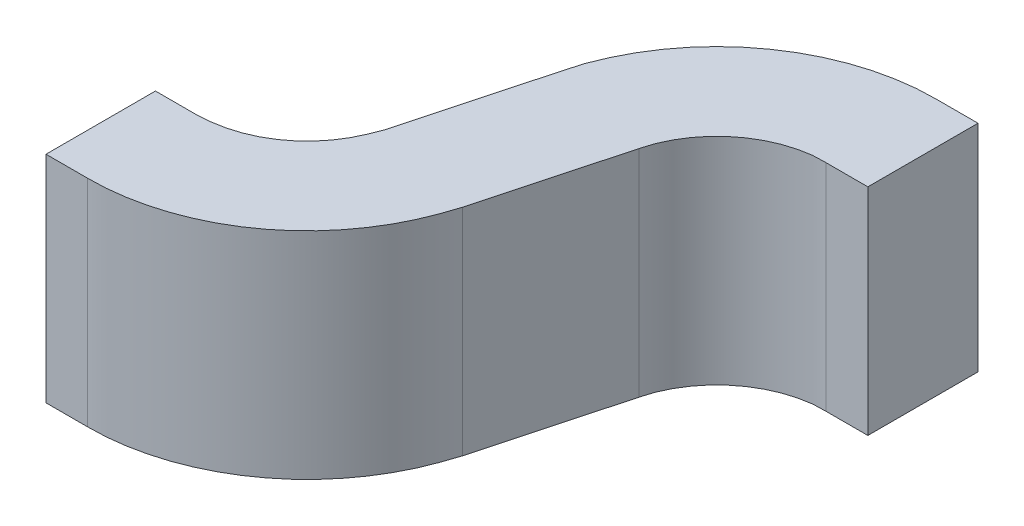
ISO-10303-21;
HEADER;
FILE_DESCRIPTION(('STEP AP214'),'2;1');
FILE_NAME('part.step','',(''),(''),'','','');
FILE_SCHEMA(('AUTOMOTIVE_DESIGN { 1 0 10303 214 1 1 1 1 }'));
ENDSEC;
DATA;
#1=APPLICATION_CONTEXT('core data for automotive mechanical design processes');
#2=APPLICATION_PROTOCOL_DEFINITION('international standard','automotive_design',2000,#1);
#3=PRODUCT_CONTEXT('',#1,'mechanical');
#4=PRODUCT('Part','Part','',(#3));
#5=PRODUCT_RELATED_PRODUCT_CATEGORY('part','',(#4));
#6=PRODUCT_DEFINITION_FORMATION('','',#4);
#7=PRODUCT_DEFINITION_CONTEXT('part definition',#1,'design');
#8=PRODUCT_DEFINITION('design','',#6,#7);
#9=PRODUCT_DEFINITION_SHAPE('','',#8);
#10=(LENGTH_UNIT() NAMED_UNIT(*) SI_UNIT(.MILLI.,.METRE.));
#11=(NAMED_UNIT(*) PLANE_ANGLE_UNIT() SI_UNIT($,.RADIAN.));
#12=(NAMED_UNIT(*) SI_UNIT($,.STERADIAN.) SOLID_ANGLE_UNIT());
#13=UNCERTAINTY_MEASURE_WITH_UNIT(LENGTH_MEASURE(1.E-05),#10,'distance_accuracy_value','');
#14=(GEOMETRIC_REPRESENTATION_CONTEXT(3) GLOBAL_UNCERTAINTY_ASSIGNED_CONTEXT((#13)) GLOBAL_UNIT_ASSIGNED_CONTEXT((#10,
#11,#12)) REPRESENTATION_CONTEXT('',''));
#15=CARTESIAN_POINT('',(0.,0.,0.));
#16=DIRECTION('',(0.,0.,1.));
#17=DIRECTION('',(1.,0.,0.));
#18=AXIS2_PLACEMENT_3D('',#15,#16,#17);
#19=CARTESIAN_POINT('',(1.054,-0.348,0.543));
#20=DIRECTION('',(-1.,0.,0.));
#21=DIRECTION('',(0.,0.,1.));
#22=AXIS2_PLACEMENT_3D('',#19,#20,#21);
#23=PLANE('',#22);
#24=DIRECTION('',(0.,1.,0.));
#25=VECTOR('',#24,1.);
#26=CARTESIAN_POINT('',(1.054,-0.653,0.543));
#27=LINE('',#26,#25);
#28=CARTESIAN_POINT('',(1.054,-0.653,0.543));
#29=VERTEX_POINT('',#28);
#30=CARTESIAN_POINT('',(1.054,-0.348,0.543));
#31=VERTEX_POINT('',#30);
#32=EDGE_CURVE('E11',#29,#31,#27,.T.);
#33=ORIENTED_EDGE('',*,*,#32,.F.);
#34=DIRECTION('',(0.,0.,-1.));
#35=VECTOR('',#34,1.);
#36=CARTESIAN_POINT('',(1.054,-0.653,0.698));
#37=LINE('',#36,#35);
#38=CARTESIAN_POINT('',(1.054,-0.653,0.698));
#39=VERTEX_POINT('',#38);
#40=EDGE_CURVE('E24',#39,#29,#37,.T.);
#41=ORIENTED_EDGE('',*,*,#40,.F.);
#42=DIRECTION('',(0.,-1.,0.));
#43=VECTOR('',#42,1.);
#44=CARTESIAN_POINT('',(1.054,-0.348,0.698));
#45=LINE('',#44,#43);
#46=CARTESIAN_POINT('',(1.054,-0.348,0.698));
#47=VERTEX_POINT('',#46);
#48=EDGE_CURVE('E439',#47,#39,#45,.T.);
#49=ORIENTED_EDGE('',*,*,#48,.F.);
#50=DIRECTION('',(0.,0.,1.));
#51=VECTOR('',#50,1.);
#52=CARTESIAN_POINT('',(1.054,-0.348,0.543));
#53=LINE('',#52,#51);
#54=EDGE_CURVE('E437',#31,#47,#53,.T.);
#55=ORIENTED_EDGE('',*,*,#54,.F.);
#56=EDGE_LOOP('',(#33,#41,#49,#55));
#57=FACE_BOUND('',#56,.T.);
#58=ADVANCED_FACE('F17',(#57),#23,.T.);
#59=CARTESIAN_POINT('',(1.054,-0.348,0.698));
#60=DIRECTION('',(0.,0.,1.));
#61=DIRECTION('',(0.,1.,0.));
#62=AXIS2_PLACEMENT_3D('',#59,#60,#61);
#63=PLANE('',#62);
#64=ORIENTED_EDGE('',*,*,#48,.T.);
#65=DIRECTION('',(-1.,0.,0.));
#66=VECTOR('',#65,1.);
#67=CARTESIAN_POINT('',(1.113,-0.653,0.698));
#68=LINE('',#67,#66);
#69=CARTESIAN_POINT('',(1.113,-0.653,0.698));
#70=VERTEX_POINT('',#69);
#71=EDGE_CURVE('E435',#70,#39,#68,.T.);
#72=ORIENTED_EDGE('',*,*,#71,.F.);
#73=CARTESIAN_POINT('',(1.113,-0.348,0.69815));
#74=DIRECTION('',(0.,-1.,0.));
#75=VECTOR('',#74,1.);
#76=LINE('',#73,#75);
#77=CARTESIAN_POINT('',(1.113,-0.348,0.698));
#78=VERTEX_POINT('',#77);
#79=EDGE_CURVE('E257',#78,#70,#76,.T.);
#80=ORIENTED_EDGE('',*,*,#79,.F.);
#81=DIRECTION('',(1.,0.,0.));
#82=VECTOR('',#81,1.);
#83=CARTESIAN_POINT('',(1.054,-0.348,0.698));
#84=LINE('',#83,#82);
#85=EDGE_CURVE('E247',#47,#78,#84,.T.);
#86=ORIENTED_EDGE('',*,*,#85,.F.);
#87=EDGE_LOOP('',(#64,#72,#80,#86));
#88=FACE_BOUND('',#87,.T.);
#89=ADVANCED_FACE('F237',(#88),#63,.T.);
#90=CARTESIAN_POINT('',(1.054,-0.653,0.543));
#91=DIRECTION('',(0.,0.,-1.));
#92=DIRECTION('',(0.,1.,0.));
#93=AXIS2_PLACEMENT_3D('',#90,#91,#92);
#94=PLANE('',#93);
#95=ORIENTED_EDGE('',*,*,#32,.T.);
#96=DIRECTION('',(-1.,0.,0.));
#97=VECTOR('',#96,1.);
#98=CARTESIAN_POINT('',(1.113,-0.348,0.543));
#99=LINE('',#98,#97);
#100=CARTESIAN_POINT('',(1.113,-0.348,0.543));
#101=VERTEX_POINT('',#100);
#102=EDGE_CURVE('E443',#101,#31,#99,.T.);
#103=ORIENTED_EDGE('',*,*,#102,.F.);
#104=CARTESIAN_POINT('',(1.113,-0.653,0.542575));
#105=DIRECTION('',(0.,1.,0.));
#106=VECTOR('',#105,1.);
#107=LINE('',#104,#106);
#108=CARTESIAN_POINT('',(1.113,-0.653,0.543));
#109=VERTEX_POINT('',#108);
#110=EDGE_CURVE('E222',#109,#101,#107,.T.);
#111=ORIENTED_EDGE('',*,*,#110,.F.);
#112=DIRECTION('',(1.,0.,0.));
#113=VECTOR('',#112,1.);
#114=CARTESIAN_POINT('',(1.054,-0.653,0.543));
#115=LINE('',#114,#113);
#116=EDGE_CURVE('E219',#29,#109,#115,.T.);
#117=ORIENTED_EDGE('',*,*,#116,.F.);
#118=EDGE_LOOP('',(#95,#103,#111,#117));
#119=FACE_BOUND('',#118,.T.);
#120=ADVANCED_FACE('F228',(#119),#94,.T.);
#121=CARTESIAN_POINT('',(1.467,-0.653,0.271));
#122=DIRECTION('',(0.965885549343203,0.,0.258969313954337));
#123=DIRECTION('',(-0.258969313954337,0.,0.965885549343203));
#124=AXIS2_PLACEMENT_3D('',#121,#122,#123);
#125=PLANE('',#124);
#126=CARTESIAN_POINT('',(1.46667799927154,-0.348,0.270914133139076));
#127=DIRECTION('',(0.,-1.,0.));
#128=VECTOR('',#127,1.);
#129=LINE('',#126,#128);
#130=CARTESIAN_POINT('',(1.467,-0.348,0.271));
#131=VERTEX_POINT('',#130);
#132=CARTESIAN_POINT('',(1.467,-0.653,0.271));
#133=VERTEX_POINT('',#132);
#134=EDGE_CURVE('E215',#131,#133,#129,.T.);
#135=ORIENTED_EDGE('',*,*,#134,.F.);
#136=CARTESIAN_POINT('',(1.414,-0.348,0.468));
#137=DIRECTION('',(0.258969313954337,0.,-0.965885549343202));
#138=VECTOR('',#137,1.);
#139=LINE('',#136,#138);
#140=CARTESIAN_POINT('',(1.414,-0.348,0.468));
#141=VERTEX_POINT('',#140);
#142=EDGE_CURVE('E301',#141,#131,#139,.T.);
#143=ORIENTED_EDGE('',*,*,#142,.F.);
#144=CARTESIAN_POINT('',(1.41346097901335,-0.653,0.467854947840802));
#145=DIRECTION('',(0.,1.,0.));
#146=VECTOR('',#145,1.);
#147=LINE('',#144,#146);
#148=CARTESIAN_POINT('',(1.414,-0.653,0.468));
#149=VERTEX_POINT('',#148);
#150=EDGE_CURVE('E288',#149,#141,#147,.T.);
#151=ORIENTED_EDGE('',*,*,#150,.F.);
#152=DIRECTION('',(-0.258969313954337,0.,0.965885549343203));
#153=VECTOR('',#152,1.);
#154=CARTESIAN_POINT('',(1.467,-0.653,0.271));
#155=LINE('',#154,#153);
#156=EDGE_CURVE('E356',#133,#149,#155,.T.);
#157=ORIENTED_EDGE('',*,*,#156,.F.);
#158=EDGE_LOOP('',(#135,#143,#151,#157));
#159=FACE_BOUND('',#158,.T.);
#160=ADVANCED_FACE('F236',(#159),#125,.T.);
#161=CARTESIAN_POINT('',(1.317,-0.348,0.231));
#162=DIRECTION('',(-0.965885549343203,0.,-0.258969313954337));
#163=DIRECTION('',(-0.258969313954337,0.,0.965885549343203));
#164=AXIS2_PLACEMENT_3D('',#161,#162,#163);
#165=PLANE('',#164);
#166=CARTESIAN_POINT('',(1.31635599854307,-0.653,0.230828266278153));
#167=DIRECTION('',(0.,1.,0.));
#168=VECTOR('',#167,1.);
#169=LINE('',#166,#168);
#170=CARTESIAN_POINT('',(1.317,-0.653,0.231));
#171=VERTEX_POINT('',#170);
#172=CARTESIAN_POINT('',(1.317,-0.348,0.231));
#173=VERTEX_POINT('',#172);
#174=EDGE_CURVE('E342',#171,#173,#169,.T.);
#175=ORIENTED_EDGE('',*,*,#174,.F.);
#176=CARTESIAN_POINT('',(1.264,-0.653,0.428));
#177=DIRECTION('',(0.258969313954337,0.,-0.965885549343202));
#178=VECTOR('',#177,1.);
#179=LINE('',#176,#178);
#180=CARTESIAN_POINT('',(1.264,-0.653,0.428));
#181=VERTEX_POINT('',#180);
#182=EDGE_CURVE('E330',#181,#171,#179,.T.);
#183=ORIENTED_EDGE('',*,*,#182,.F.);
#184=CARTESIAN_POINT('',(1.2631389278252,-0.348,0.427766198945916));
#185=DIRECTION('',(0.,-1.,0.));
#186=VECTOR('',#185,1.);
#187=LINE('',#184,#186);
#188=CARTESIAN_POINT('',(1.264,-0.348,0.428));
#189=VERTEX_POINT('',#188);
#190=EDGE_CURVE('E366',#189,#181,#187,.T.);
#191=ORIENTED_EDGE('',*,*,#190,.F.);
#192=DIRECTION('',(-0.258969313954337,0.,0.965885549343203));
#193=VECTOR('',#192,1.);
#194=CARTESIAN_POINT('',(1.317,-0.348,0.231));
#195=LINE('',#194,#193);
#196=EDGE_CURVE('E368',#173,#189,#195,.T.);
#197=ORIENTED_EDGE('',*,*,#196,.F.);
#198=EDGE_LOOP('',(#175,#183,#191,#197));
#199=FACE_BOUND('',#198,.T.);
#200=ADVANCED_FACE('F160',(#199),#165,.T.);
#201=CARTESIAN_POINT('',(1.676,-0.653,0.156));
#202=DIRECTION('',(0.,0.,1.));
#203=DIRECTION('',(0.,1.,0.));
#204=AXIS2_PLACEMENT_3D('',#201,#202,#203);
#205=PLANE('',#204);
#206=DIRECTION('',(0.,-1.,0.));
#207=VECTOR('',#206,1.);
#208=CARTESIAN_POINT('',(1.676,-0.348,0.156));
#209=LINE('',#208,#207);
#210=CARTESIAN_POINT('',(1.676,-0.348,0.156));
#211=VERTEX_POINT('',#210);
#212=CARTESIAN_POINT('',(1.676,-0.653,0.156));
#213=VERTEX_POINT('',#212);
#214=EDGE_CURVE('E125',#211,#213,#209,.T.);
#215=ORIENTED_EDGE('',*,*,#214,.F.);
#216=DIRECTION('',(1.,0.,0.));
#217=VECTOR('',#216,1.);
#218=CARTESIAN_POINT('',(1.617,-0.348,0.156));
#219=LINE('',#218,#217);
#220=CARTESIAN_POINT('',(1.617,-0.348,0.156));
#221=VERTEX_POINT('',#220);
#222=EDGE_CURVE('E377',#221,#211,#219,.T.);
#223=ORIENTED_EDGE('',*,*,#222,.F.);
#224=CARTESIAN_POINT('',(1.617,-0.653,0.155425));
#225=DIRECTION('',(0.,1.,0.));
#226=VECTOR('',#225,1.);
#227=LINE('',#224,#226);
#228=CARTESIAN_POINT('',(1.617,-0.653,0.156));
#229=VERTEX_POINT('',#228);
#230=EDGE_CURVE('E178',#229,#221,#227,.T.);
#231=ORIENTED_EDGE('',*,*,#230,.F.);
#232=DIRECTION('',(-1.,0.,0.));
#233=VECTOR('',#232,1.);
#234=CARTESIAN_POINT('',(1.676,-0.653,0.156));
#235=LINE('',#234,#233);
#236=EDGE_CURVE('E169',#213,#229,#235,.T.);
#237=ORIENTED_EDGE('',*,*,#236,.F.);
#238=EDGE_LOOP('',(#215,#223,#231,#237));
#239=FACE_BOUND('',#238,.T.);
#240=ADVANCED_FACE('F155',(#239),#205,.T.);
#241=CARTESIAN_POINT('',(1.617,-0.653,0.));
#242=DIRECTION('',(0.,0.,-1.));
#243=DIRECTION('',(0.,1.,0.));
#244=AXIS2_PLACEMENT_3D('',#241,#242,#243);
#245=PLANE('',#244);
#246=CARTESIAN_POINT('',(1.617,-0.348,-0.000149999999999977));
#247=DIRECTION('',(0.,-1.,0.));
#248=VECTOR('',#247,1.);
#249=LINE('',#246,#248);
#250=CARTESIAN_POINT('',(1.617,-0.348,0.));
#251=VERTEX_POINT('',#250);
#252=CARTESIAN_POINT('',(1.617,-0.653,0.));
#253=VERTEX_POINT('',#252);
#254=EDGE_CURVE('E140',#251,#253,#249,.T.);
#255=ORIENTED_EDGE('',*,*,#254,.F.);
#256=DIRECTION('',(-1.,0.,0.));
#257=VECTOR('',#256,1.);
#258=CARTESIAN_POINT('',(1.676,-0.348,0.));
#259=LINE('',#258,#257);
#260=CARTESIAN_POINT('',(1.676,-0.348,0.));
#261=VERTEX_POINT('',#260);
#262=EDGE_CURVE('E107',#261,#251,#259,.T.);
#263=ORIENTED_EDGE('',*,*,#262,.F.);
#264=DIRECTION('',(0.,1.,0.));
#265=VECTOR('',#264,1.);
#266=CARTESIAN_POINT('',(1.676,-0.653,0.));
#267=LINE('',#266,#265);
#268=CARTESIAN_POINT('',(1.676,-0.653,0.));
#269=VERTEX_POINT('',#268);
#270=EDGE_CURVE('E101',#269,#261,#267,.T.);
#271=ORIENTED_EDGE('',*,*,#270,.F.);
#272=DIRECTION('',(1.,0.,0.));
#273=VECTOR('',#272,1.);
#274=CARTESIAN_POINT('',(1.617,-0.653,0.));
#275=LINE('',#274,#273);
#276=EDGE_CURVE('E104',#253,#269,#275,.T.);
#277=ORIENTED_EDGE('',*,*,#276,.F.);
#278=EDGE_LOOP('',(#255,#263,#271,#277));
#279=FACE_BOUND('',#278,.T.);
#280=ADVANCED_FACE('F103',(#279),#245,.T.);
#281=CARTESIAN_POINT('',(1.676,-0.653,0.));
#282=DIRECTION('',(1.,0.,0.));
#283=DIRECTION('',(0.,0.,1.));
#284=AXIS2_PLACEMENT_3D('',#281,#282,#283);
#285=PLANE('',#284);
#286=ORIENTED_EDGE('',*,*,#270,.T.);
#287=DIRECTION('',(0.,0.,-1.));
#288=VECTOR('',#287,1.);
#289=CARTESIAN_POINT('',(1.676,-0.348,0.156));
#290=LINE('',#289,#288);
#291=EDGE_CURVE('E122',#211,#261,#290,.T.);
#292=ORIENTED_EDGE('',*,*,#291,.F.);
#293=ORIENTED_EDGE('',*,*,#214,.T.);
#294=DIRECTION('',(0.,0.,1.));
#295=VECTOR('',#294,1.);
#296=CARTESIAN_POINT('',(1.676,-0.653,0.));
#297=LINE('',#296,#295);
#298=EDGE_CURVE('E118',#269,#213,#297,.T.);
#299=ORIENTED_EDGE('',*,*,#298,.F.);
#300=EDGE_LOOP('',(#286,#292,#293,#299));
#301=FACE_BOUND('',#300,.T.);
#302=ADVANCED_FACE('F124',(#301),#285,.T.);
#303=CARTESIAN_POINT('',(1.113,-0.348,0.387));
#304=DIRECTION('',(0.,1.,0.));
#305=DIRECTION('',(0.,0.,1.));
#306=AXIS2_PLACEMENT_3D('',#303,#304,#305);
#307=CYLINDRICAL_SURFACE('',#306,0.31115);
#308=ORIENTED_EDGE('',*,*,#79,.T.);
#309=CARTESIAN_POINT('',(1.113,-0.653,0.387));
#310=DIRECTION('',(0.,-1.,0.));
#311=DIRECTION('',(-0.793107076683516,0.,0.609082231652284));
#312=AXIS2_PLACEMENT_3D('',#309,#310,#311);
#313=CIRCLE('',#312,0.31115);
#314=EDGE_CURVE('E127',#149,#70,#313,.T.);
#315=ORIENTED_EDGE('',*,*,#314,.F.);
#316=ORIENTED_EDGE('',*,*,#150,.T.);
#317=CARTESIAN_POINT('',(1.113,-0.348,0.387));
#318=DIRECTION('',(0.,1.,0.));
#319=DIRECTION('',(0.793107076683516,0.,-0.609082231652284));
#320=AXIS2_PLACEMENT_3D('',#317,#318,#319);
#321=CIRCLE('',#320,0.31115);
#322=EDGE_CURVE('E131',#78,#141,#321,.T.);
#323=ORIENTED_EDGE('',*,*,#322,.F.);
#324=EDGE_LOOP('',(#308,#315,#316,#323));
#325=FACE_BOUND('',#324,.T.);
#326=ADVANCED_FACE('F263',(#325),#307,.T.);
#327=CARTESIAN_POINT('',(1.113,-0.653,0.387));
#328=DIRECTION('',(0.,1.,0.));
#329=DIRECTION('',(0.,0.,-1.));
#330=AXIS2_PLACEMENT_3D('',#327,#328,#329);
#331=CYLINDRICAL_SURFACE('',#330,0.155575);
#332=ORIENTED_EDGE('',*,*,#110,.T.);
#333=CARTESIAN_POINT('',(1.113,-0.348,0.387));
#334=DIRECTION('',(0.,-1.,0.));
#335=DIRECTION('',(-0.793107076683516,0.,0.609082231652284));
#336=AXIS2_PLACEMENT_3D('',#333,#334,#335);
#337=CIRCLE('',#336,0.155575);
#338=EDGE_CURVE('E427',#189,#101,#337,.T.);
#339=ORIENTED_EDGE('',*,*,#338,.F.);
#340=ORIENTED_EDGE('',*,*,#190,.T.);
#341=CARTESIAN_POINT('',(1.113,-0.653,0.387));
#342=DIRECTION('',(0.,1.,0.));
#343=DIRECTION('',(0.793107076683516,0.,-0.609082231652284));
#344=AXIS2_PLACEMENT_3D('',#341,#342,#343);
#345=CIRCLE('',#344,0.155575);
#346=EDGE_CURVE('E423',#109,#181,#345,.T.);
#347=ORIENTED_EDGE('',*,*,#346,.F.);
#348=EDGE_LOOP('',(#332,#339,#340,#347));
#349=FACE_BOUND('',#348,.T.);
#350=ADVANCED_FACE('F195',(#349),#331,.F.);
#351=CARTESIAN_POINT('',(1.617,-0.653,0.311));
#352=DIRECTION('',(0.,1.,0.));
#353=DIRECTION('',(0.,0.,1.));
#354=AXIS2_PLACEMENT_3D('',#351,#352,#353);
#355=CYLINDRICAL_SURFACE('',#354,0.155575);
#356=ORIENTED_EDGE('',*,*,#230,.T.);
#357=CARTESIAN_POINT('',(1.617,-0.348,0.311));
#358=DIRECTION('',(0.,-1.,0.));
#359=DIRECTION('',(0.793107076683516,0.,-0.609082231652284));
#360=AXIS2_PLACEMENT_3D('',#357,#358,#359);
#361=CIRCLE('',#360,0.155575);
#362=EDGE_CURVE('E418',#131,#221,#361,.T.);
#363=ORIENTED_EDGE('',*,*,#362,.F.);
#364=ORIENTED_EDGE('',*,*,#134,.T.);
#365=CARTESIAN_POINT('',(1.617,-0.653,0.311));
#366=DIRECTION('',(0.,1.,0.));
#367=DIRECTION('',(-0.793107076683516,0.,0.609082231652284));
#368=AXIS2_PLACEMENT_3D('',#365,#366,#367);
#369=CIRCLE('',#368,0.155575);
#370=EDGE_CURVE('E408',#229,#133,#369,.T.);
#371=ORIENTED_EDGE('',*,*,#370,.F.);
#372=EDGE_LOOP('',(#356,#363,#364,#371));
#373=FACE_BOUND('',#372,.T.);
#374=ADVANCED_FACE('F184',(#373),#355,.F.);
#375=CARTESIAN_POINT('',(1.617,-0.653,0.311));
#376=DIRECTION('',(0.,1.,0.));
#377=DIRECTION('',(0.,0.,-1.));
#378=AXIS2_PLACEMENT_3D('',#375,#376,#377);
#379=CYLINDRICAL_SURFACE('',#378,0.31115);
#380=ORIENTED_EDGE('',*,*,#254,.T.);
#381=CARTESIAN_POINT('',(1.617,-0.653,0.311));
#382=DIRECTION('',(0.,-1.,0.));
#383=DIRECTION('',(0.793107076683516,0.,-0.609082231652284));
#384=AXIS2_PLACEMENT_3D('',#381,#382,#383);
#385=CIRCLE('',#384,0.31115);
#386=EDGE_CURVE('E121',#171,#253,#385,.T.);
#387=ORIENTED_EDGE('',*,*,#386,.F.);
#388=ORIENTED_EDGE('',*,*,#174,.T.);
#389=CARTESIAN_POINT('',(1.617,-0.348,0.311));
#390=DIRECTION('',(0.,1.,0.));
#391=DIRECTION('',(-0.793107076683516,0.,0.609082231652284));
#392=AXIS2_PLACEMENT_3D('',#389,#390,#391);
#393=CIRCLE('',#392,0.31115);
#394=EDGE_CURVE('E405',#251,#173,#393,.T.);
#395=ORIENTED_EDGE('',*,*,#394,.F.);
#396=EDGE_LOOP('',(#380,#387,#388,#395));
#397=FACE_BOUND('',#396,.T.);
#398=ADVANCED_FACE('F194',(#397),#379,.T.);
#399=CARTESIAN_POINT('',(1.054,-0.653,0.543));
#400=DIRECTION('',(0.,-1.,0.));
#401=DIRECTION('',(1.,0.,0.));
#402=AXIS2_PLACEMENT_3D('',#399,#400,#401);
#403=PLANE('',#402);
#404=ORIENTED_EDGE('',*,*,#71,.T.);
#405=ORIENTED_EDGE('',*,*,#40,.T.);
#406=ORIENTED_EDGE('',*,*,#116,.T.);
#407=ORIENTED_EDGE('',*,*,#346,.T.);
#408=ORIENTED_EDGE('',*,*,#182,.T.);
#409=ORIENTED_EDGE('',*,*,#386,.T.);
#410=ORIENTED_EDGE('',*,*,#276,.T.);
#411=ORIENTED_EDGE('',*,*,#298,.T.);
#412=ORIENTED_EDGE('',*,*,#236,.T.);
#413=ORIENTED_EDGE('',*,*,#370,.T.);
#414=ORIENTED_EDGE('',*,*,#156,.T.);
#415=ORIENTED_EDGE('',*,*,#314,.T.);
#416=EDGE_LOOP('',(#404,#405,#406,#407,#408,#409,#410,#411,#412,#413,#414,#415));
#417=FACE_BOUND('',#416,.T.);
#418=ADVANCED_FACE('F116',(#417),#403,.T.);
#419=CARTESIAN_POINT('',(1.617,-0.348,0.156));
#420=DIRECTION('',(0.,1.,0.));
#421=DIRECTION('',(1.,0.,0.));
#422=AXIS2_PLACEMENT_3D('',#419,#420,#421);
#423=PLANE('',#422);
#424=ORIENTED_EDGE('',*,*,#102,.T.);
#425=ORIENTED_EDGE('',*,*,#54,.T.);
#426=ORIENTED_EDGE('',*,*,#85,.T.);
#427=ORIENTED_EDGE('',*,*,#322,.T.);
#428=ORIENTED_EDGE('',*,*,#142,.T.);
#429=ORIENTED_EDGE('',*,*,#362,.T.);
#430=ORIENTED_EDGE('',*,*,#222,.T.);
#431=ORIENTED_EDGE('',*,*,#291,.T.);
#432=ORIENTED_EDGE('',*,*,#262,.T.);
#433=ORIENTED_EDGE('',*,*,#394,.T.);
#434=ORIENTED_EDGE('',*,*,#196,.T.);
#435=ORIENTED_EDGE('',*,*,#338,.T.);
#436=EDGE_LOOP('',(#424,#425,#426,#427,#428,#429,#430,#431,#432,#433,#434,#435));
#437=FACE_BOUND('',#436,.T.);
#438=ADVANCED_FACE('F306',(#437),#423,.T.);
#439=CLOSED_SHELL('',(#58,#89,#120,#160,#200,#240,#280,#302,#326,#350,#374,#398,#418,#438));
#440=MANIFOLD_SOLID_BREP('B1',#439);
#441=ADVANCED_BREP_SHAPE_REPRESENTATION('',(#18,#440),#14);
#442=SHAPE_DEFINITION_REPRESENTATION(#9,#441);
ENDSEC;
END-ISO-10303-21;
